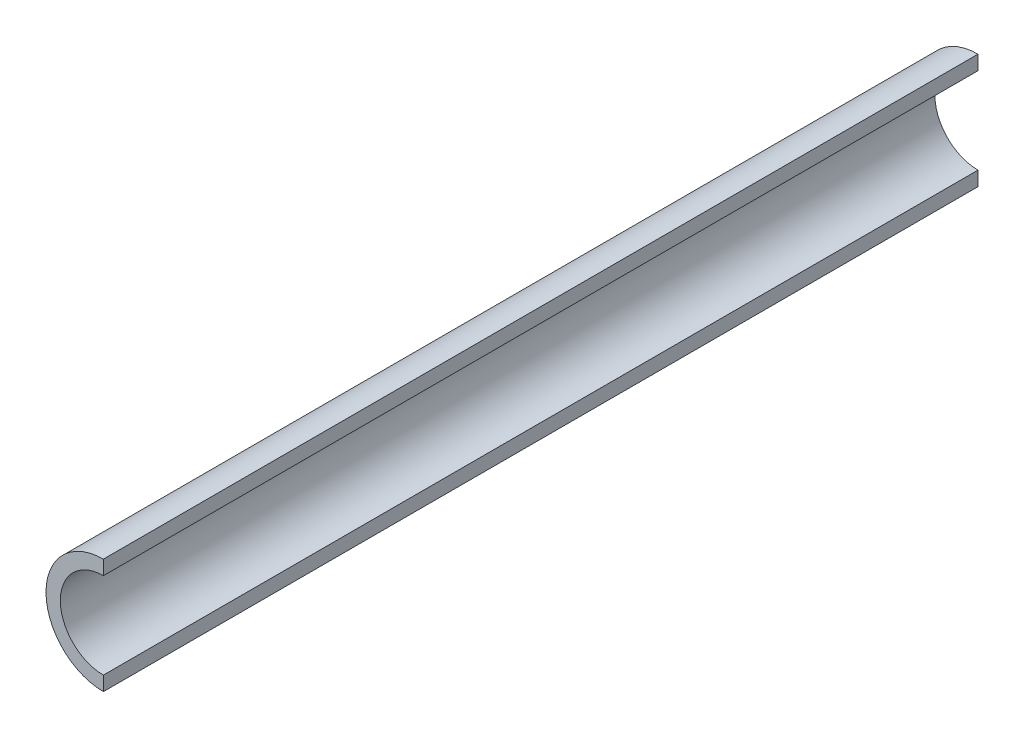
ISO-10303-21;
HEADER;
FILE_DESCRIPTION(('STEP AP214'),'2;1');
FILE_NAME('part.step','',(''),(''),'','','');
FILE_SCHEMA(('AUTOMOTIVE_DESIGN { 1 0 10303 214 1 1 1 1 }'));
ENDSEC;
DATA;
#1=APPLICATION_CONTEXT('core data for automotive mechanical design processes');
#2=APPLICATION_PROTOCOL_DEFINITION('international standard','automotive_design',2000,#1);
#3=PRODUCT_CONTEXT('',#1,'mechanical');
#4=PRODUCT('Part','Part','',(#3));
#5=PRODUCT_RELATED_PRODUCT_CATEGORY('part','',(#4));
#6=PRODUCT_DEFINITION_FORMATION('','',#4);
#7=PRODUCT_DEFINITION_CONTEXT('part definition',#1,'design');
#8=PRODUCT_DEFINITION('design','',#6,#7);
#9=PRODUCT_DEFINITION_SHAPE('','',#8);
#10=(LENGTH_UNIT() NAMED_UNIT(*) SI_UNIT(.MILLI.,.METRE.));
#11=(NAMED_UNIT(*) PLANE_ANGLE_UNIT() SI_UNIT($,.RADIAN.));
#12=(NAMED_UNIT(*) SI_UNIT($,.STERADIAN.) SOLID_ANGLE_UNIT());
#13=UNCERTAINTY_MEASURE_WITH_UNIT(LENGTH_MEASURE(1.E-05),#10,'distance_accuracy_value','');
#14=(GEOMETRIC_REPRESENTATION_CONTEXT(3) GLOBAL_UNCERTAINTY_ASSIGNED_CONTEXT((#13)) GLOBAL_UNIT_ASSIGNED_CONTEXT((#10,
#11,#12)) REPRESENTATION_CONTEXT('',''));
#15=CARTESIAN_POINT('',(0.,0.,0.));
#16=DIRECTION('',(0.,0.,1.));
#17=DIRECTION('',(1.,0.,0.));
#18=AXIS2_PLACEMENT_3D('',#15,#16,#17);
#19=CARTESIAN_POINT('',(0.,0.,304.8));
#20=DIRECTION('',(-1.,0.,0.));
#21=DIRECTION('',(0.,0.,1.));
#22=AXIS2_PLACEMENT_3D('',#19,#20,#21);
#23=PLANE('',#22);
#24=DIRECTION('',(0.,1.,0.));
#25=VECTOR('',#24,1.);
#26=CARTESIAN_POINT('',(0.,0.,0.));
#27=LINE('',#26,#25);
#28=CARTESIAN_POINT('',(0.,0.,0.));
#29=VERTEX_POINT('',#28);
#30=CARTESIAN_POINT('',(0.,5.,0.));
#31=VERTEX_POINT('',#30);
#32=EDGE_CURVE('E113',#29,#31,#27,.T.);
#33=ORIENTED_EDGE('',*,*,#32,.T.);
#34=DIRECTION('',(0.,0.,-1.));
#35=VECTOR('',#34,1.);
#36=CARTESIAN_POINT('',(0.,5.,304.8));
#37=LINE('',#36,#35);
#38=CARTESIAN_POINT('',(0.,5.,304.8));
#39=VERTEX_POINT('',#38);
#40=EDGE_CURVE('E11',#39,#31,#37,.T.);
#41=ORIENTED_EDGE('',*,*,#40,.F.);
#42=DIRECTION('',(0.,1.,0.));
#43=VECTOR('',#42,1.);
#44=CARTESIAN_POINT('',(0.,0.,304.8));
#45=LINE('',#44,#43);
#46=CARTESIAN_POINT('',(0.,0.,304.8));
#47=VERTEX_POINT('',#46);
#48=EDGE_CURVE('E95',#47,#39,#45,.T.);
#49=ORIENTED_EDGE('',*,*,#48,.F.);
#50=DIRECTION('',(0.,0.,-1.));
#51=VECTOR('',#50,1.);
#52=CARTESIAN_POINT('',(0.,0.,304.8));
#53=LINE('',#52,#51);
#54=EDGE_CURVE('E62',#47,#29,#53,.T.);
#55=ORIENTED_EDGE('',*,*,#54,.T.);
#56=EDGE_LOOP('',(#33,#41,#49,#55));
#57=FACE_BOUND('',#56,.T.);
#58=ADVANCED_FACE('F45',(#57),#23,.F.);
#59=CARTESIAN_POINT('',(0.,20.,304.8));
#60=DIRECTION('',(0.,0.,-1.));
#61=DIRECTION('',(-1.,0.,0.));
#62=AXIS2_PLACEMENT_3D('',#59,#60,#61);
#63=CYLINDRICAL_SURFACE('',#62,15.);
#64=CARTESIAN_POINT('',(0.,20.,0.));
#65=DIRECTION('',(0.,0.,-1.));
#66=DIRECTION('',(-1.,0.,0.));
#67=AXIS2_PLACEMENT_3D('',#64,#65,#66);
#68=CIRCLE('',#67,15.);
#69=CARTESIAN_POINT('',(0.,35.,0.));
#70=VERTEX_POINT('',#69);
#71=EDGE_CURVE('E101',#31,#70,#68,.T.);
#72=ORIENTED_EDGE('',*,*,#71,.T.);
#73=DIRECTION('',(0.,0.,-1.));
#74=VECTOR('',#73,1.);
#75=CARTESIAN_POINT('',(0.,35.,304.8));
#76=LINE('',#75,#74);
#77=CARTESIAN_POINT('',(0.,35.,304.8));
#78=VERTEX_POINT('',#77);
#79=EDGE_CURVE('E54',#78,#70,#76,.T.);
#80=ORIENTED_EDGE('',*,*,#79,.F.);
#81=CARTESIAN_POINT('',(0.,20.,304.8));
#82=DIRECTION('',(0.,0.,-1.));
#83=DIRECTION('',(-1.,0.,0.));
#84=AXIS2_PLACEMENT_3D('',#81,#82,#83);
#85=CIRCLE('',#84,15.);
#86=EDGE_CURVE('E87',#39,#78,#85,.T.);
#87=ORIENTED_EDGE('',*,*,#86,.F.);
#88=ORIENTED_EDGE('',*,*,#40,.T.);
#89=EDGE_LOOP('',(#72,#80,#87,#88));
#90=FACE_BOUND('',#89,.T.);
#91=ADVANCED_FACE('F100',(#90),#63,.F.);
#92=CARTESIAN_POINT('',(0.,40.,304.8));
#93=DIRECTION('',(1.,0.,0.));
#94=DIRECTION('',(0.,1.,0.));
#95=AXIS2_PLACEMENT_3D('',#92,#93,#94);
#96=PLANE('',#95);
#97=DIRECTION('',(0.,-1.,0.));
#98=VECTOR('',#97,1.);
#99=CARTESIAN_POINT('',(0.,40.,0.));
#100=LINE('',#99,#98);
#101=CARTESIAN_POINT('',(0.,40.,0.));
#102=VERTEX_POINT('',#101);
#103=EDGE_CURVE('E118',#102,#70,#100,.T.);
#104=ORIENTED_EDGE('',*,*,#103,.F.);
#105=DIRECTION('',(0.,0.,-1.));
#106=VECTOR('',#105,1.);
#107=CARTESIAN_POINT('',(0.,40.,304.8));
#108=LINE('',#107,#106);
#109=CARTESIAN_POINT('',(0.,40.,304.8));
#110=VERTEX_POINT('',#109);
#111=EDGE_CURVE('E76',#110,#102,#108,.T.);
#112=ORIENTED_EDGE('',*,*,#111,.F.);
#113=DIRECTION('',(0.,-1.,0.));
#114=VECTOR('',#113,1.);
#115=CARTESIAN_POINT('',(0.,40.,304.8));
#116=LINE('',#115,#114);
#117=EDGE_CURVE('E94',#110,#78,#116,.T.);
#118=ORIENTED_EDGE('',*,*,#117,.T.);
#119=ORIENTED_EDGE('',*,*,#79,.T.);
#120=EDGE_LOOP('',(#104,#112,#118,#119));
#121=FACE_BOUND('',#120,.T.);
#122=ADVANCED_FACE('F105',(#121),#96,.T.);
#123=CARTESIAN_POINT('',(0.,20.,304.8));
#124=DIRECTION('',(0.,0.,-1.));
#125=DIRECTION('',(-1.,0.,0.));
#126=AXIS2_PLACEMENT_3D('',#123,#124,#125);
#127=CYLINDRICAL_SURFACE('',#126,20.);
#128=CARTESIAN_POINT('',(0.,20.,0.));
#129=DIRECTION('',(0.,0.,-1.));
#130=DIRECTION('',(-1.,0.,0.));
#131=AXIS2_PLACEMENT_3D('',#128,#129,#130);
#132=CIRCLE('',#131,20.);
#133=EDGE_CURVE('E121',#29,#102,#132,.T.);
#134=ORIENTED_EDGE('',*,*,#133,.F.);
#135=ORIENTED_EDGE('',*,*,#54,.F.);
#136=CARTESIAN_POINT('',(0.,20.,304.8));
#137=DIRECTION('',(0.,0.,-1.));
#138=DIRECTION('',(-1.,0.,0.));
#139=AXIS2_PLACEMENT_3D('',#136,#137,#138);
#140=CIRCLE('',#139,20.);
#141=EDGE_CURVE('E107',#47,#110,#140,.T.);
#142=ORIENTED_EDGE('',*,*,#141,.T.);
#143=ORIENTED_EDGE('',*,*,#111,.T.);
#144=EDGE_LOOP('',(#134,#135,#142,#143));
#145=FACE_BOUND('',#144,.T.);
#146=ADVANCED_FACE('F131',(#145),#127,.T.);
#147=CARTESIAN_POINT('',(0.,20.,304.8));
#148=DIRECTION('',(0.,0.,-1.));
#149=DIRECTION('',(-1.,0.,0.));
#150=AXIS2_PLACEMENT_3D('',#147,#148,#149);
#151=PLANE('',#150);
#152=ORIENTED_EDGE('',*,*,#48,.T.);
#153=ORIENTED_EDGE('',*,*,#86,.T.);
#154=ORIENTED_EDGE('',*,*,#117,.F.);
#155=ORIENTED_EDGE('',*,*,#141,.F.);
#156=EDGE_LOOP('',(#152,#153,#154,#155));
#157=FACE_BOUND('',#156,.T.);
#158=ADVANCED_FACE('F91',(#157),#151,.F.);
#159=CARTESIAN_POINT('',(0.,20.,0.));
#160=DIRECTION('',(0.,0.,-1.));
#161=DIRECTION('',(-1.,0.,0.));
#162=AXIS2_PLACEMENT_3D('',#159,#160,#161);
#163=PLANE('',#162);
#164=ORIENTED_EDGE('',*,*,#32,.F.);
#165=ORIENTED_EDGE('',*,*,#133,.T.);
#166=ORIENTED_EDGE('',*,*,#103,.T.);
#167=ORIENTED_EDGE('',*,*,#71,.F.);
#168=EDGE_LOOP('',(#164,#165,#166,#167));
#169=FACE_BOUND('',#168,.T.);
#170=ADVANCED_FACE('F130',(#169),#163,.T.);
#171=CLOSED_SHELL('',(#58,#91,#122,#146,#158,#170));
#172=MANIFOLD_SOLID_BREP('B2',#171);
#173=ADVANCED_BREP_SHAPE_REPRESENTATION('',(#18,#172),#14);
#174=SHAPE_DEFINITION_REPRESENTATION(#9,#173);
ENDSEC;
END-ISO-10303-21;
